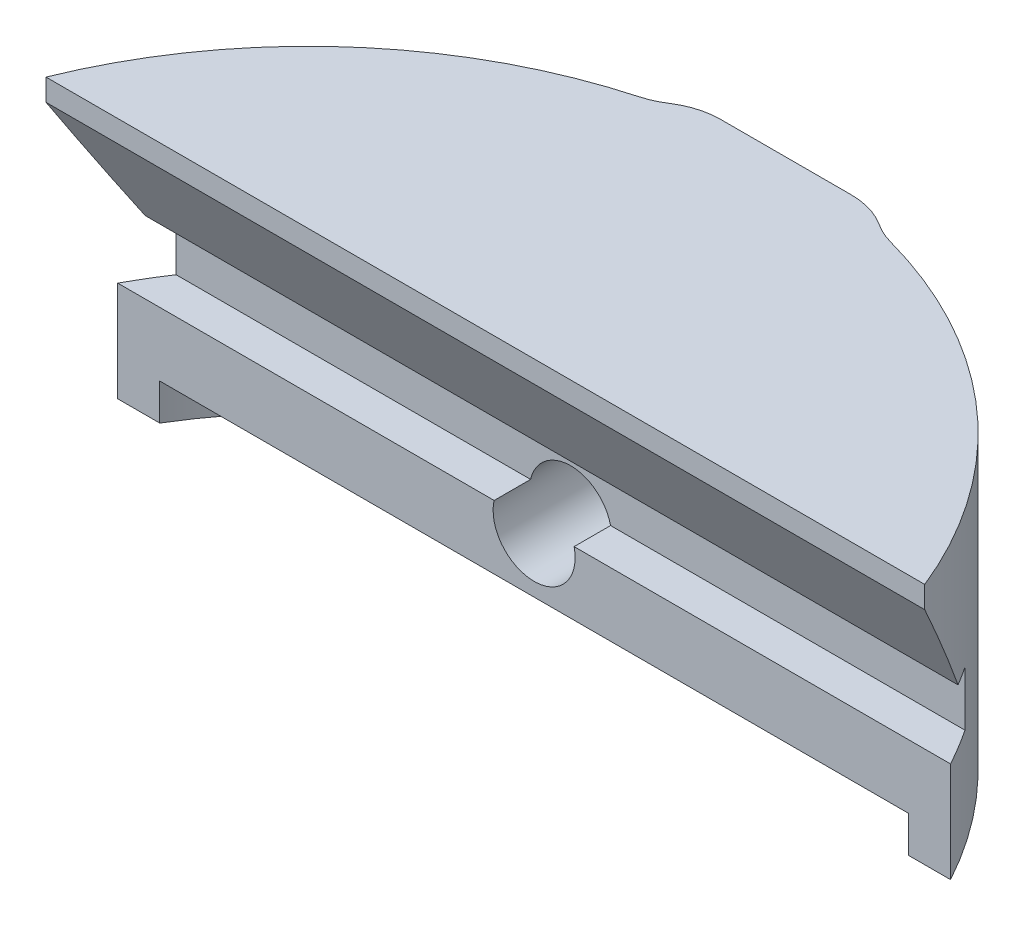
ISO-10303-21;
HEADER;
FILE_DESCRIPTION(('STEP AP214'),'2;1');
FILE_NAME('part.step','',(''),(''),'','','');
FILE_SCHEMA(('AUTOMOTIVE_DESIGN { 1 0 10303 214 1 1 1 1 }'));
ENDSEC;
DATA;
#1=APPLICATION_CONTEXT('core data for automotive mechanical design processes');
#2=APPLICATION_PROTOCOL_DEFINITION('international standard','automotive_design',2000,#1);
#3=PRODUCT_CONTEXT('',#1,'mechanical');
#4=PRODUCT('Part','Part','',(#3));
#5=PRODUCT_RELATED_PRODUCT_CATEGORY('part','',(#4));
#6=PRODUCT_DEFINITION_FORMATION('','',#4);
#7=PRODUCT_DEFINITION_CONTEXT('part definition',#1,'design');
#8=PRODUCT_DEFINITION('design','',#6,#7);
#9=PRODUCT_DEFINITION_SHAPE('','',#8);
#10=(LENGTH_UNIT() NAMED_UNIT(*) SI_UNIT(.MILLI.,.METRE.));
#11=(NAMED_UNIT(*) PLANE_ANGLE_UNIT() SI_UNIT($,.RADIAN.));
#12=(NAMED_UNIT(*) SI_UNIT($,.STERADIAN.) SOLID_ANGLE_UNIT());
#13=UNCERTAINTY_MEASURE_WITH_UNIT(LENGTH_MEASURE(1.E-05),#10,'distance_accuracy_value','');
#14=(GEOMETRIC_REPRESENTATION_CONTEXT(3) GLOBAL_UNCERTAINTY_ASSIGNED_CONTEXT((#13)) GLOBAL_UNIT_ASSIGNED_CONTEXT((#10,
#11,#12)) REPRESENTATION_CONTEXT('',''));
#15=CARTESIAN_POINT('',(0.,0.,0.));
#16=DIRECTION('',(0.,0.,1.));
#17=DIRECTION('',(1.,0.,0.));
#18=AXIS2_PLACEMENT_3D('',#15,#16,#17);
#19=CARTESIAN_POINT('',(-24.1112428610131,3.5,-14.4047005383793));
#20=DIRECTION('',(0.,-1.,0.));
#21=DIRECTION('',(0.,0.,-1.));
#22=AXIS2_PLACEMENT_3D('',#19,#20,#21);
#23=PLANE('',#22);
#24=DIRECTION('',(-1.,0.,0.));
#25=VECTOR('',#24,1.);
#26=CARTESIAN_POINT('',(-26.,3.5,-12.4047005383793));
#27=LINE('',#26,#25);
#28=CARTESIAN_POINT('',(-2.19374109684802,3.5,-12.4047005383793));
#29=VERTEX_POINT('',#28);
#30=CARTESIAN_POINT('',(-22.8500197932766,3.5,-12.4047005383793));
#31=VERTEX_POINT('',#30);
#32=EDGE_CURVE('E234',#29,#31,#27,.T.);
#33=ORIENTED_EDGE('',*,*,#32,.F.);
#34=DIRECTION('',(0.,0.,-1.));
#35=VECTOR('',#34,1.);
#36=CARTESIAN_POINT('',(-2.19374109684802,3.5,-26.2287187078898));
#37=LINE('',#36,#35);
#38=CARTESIAN_POINT('',(-2.19374109684802,3.5,-14.4047005383793));
#39=VERTEX_POINT('',#38);
#40=EDGE_CURVE('E11',#29,#39,#37,.T.);
#41=ORIENTED_EDGE('',*,*,#40,.T.);
#42=DIRECTION('',(1.,0.,0.));
#43=VECTOR('',#42,1.);
#44=CARTESIAN_POINT('',(-24.1112428610131,3.5,-14.4047005383793));
#45=LINE('',#44,#43);
#46=CARTESIAN_POINT('',(-21.6449671378733,3.5,-14.4047005383793));
#47=VERTEX_POINT('',#46);
#48=EDGE_CURVE('E168',#47,#39,#45,.T.);
#49=ORIENTED_EDGE('',*,*,#48,.F.);
#50=CARTESIAN_POINT('',(0.,3.5,0.));
#51=DIRECTION('',(0.,-1.,0.));
#52=DIRECTION('',(0.,0.,-1.));
#53=AXIS2_PLACEMENT_3D('',#50,#51,#52);
#54=CIRCLE('',#53,26.);
#55=EDGE_CURVE('E182',#31,#47,#54,.T.);
#56=ORIENTED_EDGE('',*,*,#55,.F.);
#57=EDGE_LOOP('',(#33,#41,#49,#56));
#58=FACE_BOUND('',#57,.T.);
#59=ADVANCED_FACE('F38',(#58),#23,.F.);
#60=CARTESIAN_POINT('',(0.,14.,0.));
#61=DIRECTION('',(0.,-1.,0.));
#62=DIRECTION('',(0.,0.,-1.));
#63=AXIS2_PLACEMENT_3D('',#60,#61,#62);
#64=CYLINDRICAL_SURFACE('',#63,26.);
#65=CARTESIAN_POINT('',(0.,-2.,0.));
#66=DIRECTION('',(0.,-1.,0.));
#67=DIRECTION('',(0.,0.,-1.));
#68=AXIS2_PLACEMENT_3D('',#65,#66,#67);
#69=CIRCLE('',#68,26.);
#70=CARTESIAN_POINT('',(6.89281123940693,-2.,-25.0696859417486));
#71=VERTEX_POINT('',#70);
#72=CARTESIAN_POINT('',(22.8500197932766,-2.,-12.4047005383793));
#73=VERTEX_POINT('',#72);
#74=EDGE_CURVE('E202',#71,#73,#69,.T.);
#75=ORIENTED_EDGE('',*,*,#74,.F.);
#76=DIRECTION('',(0.,-1.,0.));
#77=VECTOR('',#76,1.);
#78=CARTESIAN_POINT('',(6.89281123940693,14.,-25.0696859417486));
#79=LINE('',#78,#77);
#80=CARTESIAN_POINT('',(6.89281123940693,14.,-25.0696859417486));
#81=VERTEX_POINT('',#80);
#82=EDGE_CURVE('E245',#71,#81,#79,.F.);
#83=ORIENTED_EDGE('',*,*,#82,.T.);
#84=CARTESIAN_POINT('',(0.,14.,0.));
#85=DIRECTION('',(0.,1.,0.));
#86=DIRECTION('',(0.,0.,1.));
#87=AXIS2_PLACEMENT_3D('',#84,#85,#86);
#88=CIRCLE('',#87,26.);
#89=CARTESIAN_POINT('',(24.1112428610131,14.,-9.72871870788977));
#90=VERTEX_POINT('',#89);
#91=EDGE_CURVE('E219',#90,#81,#88,.T.);
#92=ORIENTED_EDGE('',*,*,#91,.F.);
#93=DIRECTION('',(0.,-1.,0.));
#94=VECTOR('',#93,1.);
#95=CARTESIAN_POINT('',(24.1112428610131,14.,-9.72871870788977));
#96=LINE('',#95,#94);
#97=CARTESIAN_POINT('',(24.1112428610131,12.8,-9.72871870788977));
#98=VERTEX_POINT('',#97);
#99=EDGE_CURVE('E215',#90,#98,#96,.T.);
#100=ORIENTED_EDGE('',*,*,#99,.T.);
#101=CARTESIAN_POINT('',(0.,29.6506350946107,0.));
#102=DIRECTION('',(0.,0.500000000000004,-0.866025403784436));
#103=DIRECTION('',(0.,-0.866025403784436,-0.500000000000004));
#104=AXIS2_PLACEMENT_3D('',#101,#102,#103);
#105=ELLIPSE('',#104,51.9999999999995,26.);
#106=CARTESIAN_POINT('',(22.3013310119685,6.5,-13.3660254037844));
#107=VERTEX_POINT('',#106);
#108=EDGE_CURVE('E227',#98,#107,#105,.T.);
#109=ORIENTED_EDGE('',*,*,#108,.T.);
#110=CARTESIAN_POINT('',(0.,6.5,0.));
#111=DIRECTION('',(0.,1.,0.));
#112=DIRECTION('',(0.,0.,1.));
#113=AXIS2_PLACEMENT_3D('',#110,#111,#112);
#114=CIRCLE('',#113,26.);
#115=CARTESIAN_POINT('',(21.6449671378733,6.5,-14.4047005383793));
#116=VERTEX_POINT('',#115);
#117=EDGE_CURVE('E188',#107,#116,#114,.T.);
#118=ORIENTED_EDGE('',*,*,#117,.T.);
#119=DIRECTION('',(0.,-1.,0.));
#120=VECTOR('',#119,1.);
#121=CARTESIAN_POINT('',(21.6449671378733,14.,-14.4047005383793));
#122=LINE('',#121,#120);
#123=CARTESIAN_POINT('',(21.6449671378733,3.5,-14.4047005383793));
#124=VERTEX_POINT('',#123);
#125=EDGE_CURVE('E243',#116,#124,#122,.T.);
#126=ORIENTED_EDGE('',*,*,#125,.T.);
#127=CARTESIAN_POINT('',(22.8500197932766,3.5,-12.4047005383793));
#128=VERTEX_POINT('',#127);
#129=EDGE_CURVE('E173',#124,#128,#54,.T.);
#130=ORIENTED_EDGE('',*,*,#129,.T.);
#131=DIRECTION('',(0.,-1.,0.));
#132=VECTOR('',#131,1.);
#133=CARTESIAN_POINT('',(22.8500197932766,14.,-12.4047005383793));
#134=LINE('',#133,#132);
#135=EDGE_CURVE('E231',#128,#73,#134,.T.);
#136=ORIENTED_EDGE('',*,*,#135,.T.);
#137=EDGE_LOOP('',(#75,#83,#92,#100,#109,#118,#126,#130,#136));
#138=FACE_BOUND('',#137,.T.);
#139=ADVANCED_FACE('F316',(#138),#64,.T.);
#140=CARTESIAN_POINT('',(-6.89281123940694,14.,-25.0696859417486));
#141=VERTEX_POINT('',#140);
#142=CARTESIAN_POINT('',(-24.1112428610131,14.,-9.72871870788977));
#143=VERTEX_POINT('',#142);
#144=EDGE_CURVE('E218',#141,#143,#88,.T.);
#145=ORIENTED_EDGE('',*,*,#144,.F.);
#146=DIRECTION('',(0.,-1.,0.));
#147=VECTOR('',#146,1.);
#148=CARTESIAN_POINT('',(-6.89281123940694,14.,-25.0696859417486));
#149=LINE('',#148,#147);
#150=CARTESIAN_POINT('',(-6.89281123940694,-2.,-25.0696859417486));
#151=VERTEX_POINT('',#150);
#152=EDGE_CURVE('E248',#141,#151,#149,.T.);
#153=ORIENTED_EDGE('',*,*,#152,.T.);
#154=CARTESIAN_POINT('',(-22.8500197932766,-2.,-12.4047005383793));
#155=VERTEX_POINT('',#154);
#156=EDGE_CURVE('E206',#155,#151,#69,.T.);
#157=ORIENTED_EDGE('',*,*,#156,.F.);
#158=DIRECTION('',(0.,-1.,0.));
#159=VECTOR('',#158,1.);
#160=CARTESIAN_POINT('',(-22.8500197932766,14.,-12.4047005383793));
#161=LINE('',#160,#159);
#162=EDGE_CURVE('E228',#155,#31,#161,.F.);
#163=ORIENTED_EDGE('',*,*,#162,.T.);
#164=ORIENTED_EDGE('',*,*,#55,.T.);
#165=DIRECTION('',(0.,-1.,0.));
#166=VECTOR('',#165,1.);
#167=CARTESIAN_POINT('',(-21.6449671378733,14.,-14.4047005383793));
#168=LINE('',#167,#166);
#169=CARTESIAN_POINT('',(-21.6449671378733,6.5,-14.4047005383793));
#170=VERTEX_POINT('',#169);
#171=EDGE_CURVE('E240',#47,#170,#168,.F.);
#172=ORIENTED_EDGE('',*,*,#171,.T.);
#173=CARTESIAN_POINT('',(-22.3013310119685,6.5,-13.3660254037844));
#174=VERTEX_POINT('',#173);
#175=EDGE_CURVE('E185',#170,#174,#114,.T.);
#176=ORIENTED_EDGE('',*,*,#175,.T.);
#177=CARTESIAN_POINT('',(-24.1112428610131,12.8,-9.72871870788977));
#178=VERTEX_POINT('',#177);
#179=EDGE_CURVE('E225',#174,#178,#105,.T.);
#180=ORIENTED_EDGE('',*,*,#179,.T.);
#181=DIRECTION('',(0.,-1.,0.));
#182=VECTOR('',#181,1.);
#183=CARTESIAN_POINT('',(-24.1112428610131,14.,-9.72871870788977));
#184=LINE('',#183,#182);
#185=EDGE_CURVE('E212',#178,#143,#184,.F.);
#186=ORIENTED_EDGE('',*,*,#185,.T.);
#187=EDGE_LOOP('',(#145,#153,#157,#163,#164,#172,#176,#180,#186));
#188=FACE_BOUND('',#187,.T.);
#189=ADVANCED_FACE('F321',(#188),#64,.T.);
#190=CARTESIAN_POINT('',(0.,0.,0.));
#191=DIRECTION('',(0.,1.,0.));
#192=DIRECTION('',(0.,0.,1.));
#193=AXIS2_PLACEMENT_3D('',#190,#191,#192);
#194=PLANE('',#193);
#195=CARTESIAN_POINT('',(0.,0.,0.));
#196=DIRECTION('',(0.,-1.,0.));
#197=DIRECTION('',(0.,0.,-1.));
#198=AXIS2_PLACEMENT_3D('',#195,#196,#197);
#199=CIRCLE('',#198,24.);
#200=CARTESIAN_POINT('',(-20.5456419844485,0.,-12.4047005383793));
#201=VERTEX_POINT('',#200);
#202=CARTESIAN_POINT('',(20.5456419844485,0.,-12.4047005383793));
#203=VERTEX_POINT('',#202);
#204=EDGE_CURVE('E203',#201,#203,#199,.T.);
#205=ORIENTED_EDGE('',*,*,#204,.T.);
#206=DIRECTION('',(-1.,0.,0.));
#207=VECTOR('',#206,1.);
#208=CARTESIAN_POINT('',(0.,0.,-12.4047005383793));
#209=LINE('',#208,#207);
#210=EDGE_CURVE('E194',#203,#201,#209,.T.);
#211=ORIENTED_EDGE('',*,*,#210,.T.);
#212=EDGE_LOOP('',(#205,#211));
#213=FACE_BOUND('',#212,.T.);
#214=ADVANCED_FACE('F338',(#213),#194,.F.);
#215=CARTESIAN_POINT('',(0.,-2.,0.));
#216=DIRECTION('',(0.,-1.,0.));
#217=DIRECTION('',(0.,0.,-1.));
#218=AXIS2_PLACEMENT_3D('',#215,#216,#217);
#219=PLANE('',#218);
#220=DIRECTION('',(-1.,0.,0.));
#221=VECTOR('',#220,1.);
#222=CARTESIAN_POINT('',(-5.,-2.,-26.2287187078898));
#223=LINE('',#222,#221);
#224=CARTESIAN_POINT('',(3.57843944253177,-2.,-26.2287187078898));
#225=VERTEX_POINT('',#224);
#226=CARTESIAN_POINT('',(-3.57843944253178,-2.,-26.2287187078898));
#227=VERTEX_POINT('',#226);
#228=EDGE_CURVE('E175',#225,#227,#223,.T.);
#229=ORIENTED_EDGE('',*,*,#228,.F.);
#230=CARTESIAN_POINT('',(3.57843944253177,-2.,-22.2287187078898));
#231=DIRECTION('',(0.,-1.,0.));
#232=DIRECTION('',(0.,0.,-1.));
#233=AXIS2_PLACEMENT_3D('',#230,#231,#232);
#234=CIRCLE('',#233,4.);
#235=CARTESIAN_POINT('',(5.76584159015449,-2.,-25.5776397049537));
#236=VERTEX_POINT('',#235);
#237=EDGE_CURVE('E273',#225,#236,#234,.T.);
#238=ORIENTED_EDGE('',*,*,#237,.T.);
#239=CARTESIAN_POINT('',(7.95324373777722,-2.,-28.9265607020176));
#240=DIRECTION('',(0.,-1.,0.));
#241=DIRECTION('',(0.,0.,-1.));
#242=AXIS2_PLACEMENT_3D('',#239,#240,#241);
#243=CIRCLE('',#242,4.);
#244=EDGE_CURVE('E253',#236,#71,#243,.F.);
#245=ORIENTED_EDGE('',*,*,#244,.T.);
#246=ORIENTED_EDGE('',*,*,#74,.T.);
#247=DIRECTION('',(1.,0.,0.));
#248=VECTOR('',#247,1.);
#249=CARTESIAN_POINT('',(0.,-2.,-12.4047005383793));
#250=LINE('',#249,#248);
#251=CARTESIAN_POINT('',(20.5456419844485,-2.,-12.4047005383793));
#252=VERTEX_POINT('',#251);
#253=EDGE_CURVE('E192',#252,#73,#250,.T.);
#254=ORIENTED_EDGE('',*,*,#253,.F.);
#255=CARTESIAN_POINT('',(0.,-2.,0.));
#256=DIRECTION('',(0.,-1.,0.));
#257=DIRECTION('',(0.,0.,-1.));
#258=AXIS2_PLACEMENT_3D('',#255,#256,#257);
#259=CIRCLE('',#258,24.);
#260=CARTESIAN_POINT('',(-20.5456419844485,-2.,-12.4047005383793));
#261=VERTEX_POINT('',#260);
#262=EDGE_CURVE('E199',#261,#252,#259,.T.);
#263=ORIENTED_EDGE('',*,*,#262,.F.);
#264=EDGE_CURVE('E189',#155,#261,#250,.T.);
#265=ORIENTED_EDGE('',*,*,#264,.F.);
#266=ORIENTED_EDGE('',*,*,#156,.T.);
#267=CARTESIAN_POINT('',(-7.95324373777724,-2.,-28.9265607020176));
#268=DIRECTION('',(0.,-1.,0.));
#269=DIRECTION('',(0.,0.,-1.));
#270=AXIS2_PLACEMENT_3D('',#267,#268,#269);
#271=CIRCLE('',#270,4.);
#272=CARTESIAN_POINT('',(-5.76584159015451,-2.,-25.5776397049537));
#273=VERTEX_POINT('',#272);
#274=EDGE_CURVE('E257',#151,#273,#271,.F.);
#275=ORIENTED_EDGE('',*,*,#274,.T.);
#276=CARTESIAN_POINT('',(-3.57843944253178,-2.,-22.2287187078898));
#277=DIRECTION('',(0.,-1.,0.));
#278=DIRECTION('',(0.,0.,-1.));
#279=AXIS2_PLACEMENT_3D('',#276,#277,#278);
#280=CIRCLE('',#279,4.);
#281=EDGE_CURVE('E271',#273,#227,#280,.T.);
#282=ORIENTED_EDGE('',*,*,#281,.T.);
#283=EDGE_LOOP('',(#229,#238,#245,#246,#254,#263,#265,#266,#275,#282));
#284=FACE_BOUND('',#283,.T.);
#285=ADVANCED_FACE('F279',(#284),#219,.T.);
#286=CARTESIAN_POINT('',(0.,-2.,0.));
#287=DIRECTION('',(0.,1.,0.));
#288=DIRECTION('',(0.,0.,1.));
#289=AXIS2_PLACEMENT_3D('',#286,#287,#288);
#290=CYLINDRICAL_SURFACE('',#289,24.);
#291=DIRECTION('',(0.,1.,0.));
#292=VECTOR('',#291,1.);
#293=CARTESIAN_POINT('',(-20.5456419844485,-2.,-12.4047005383793));
#294=LINE('',#293,#292);
#295=EDGE_CURVE('E191',#261,#201,#294,.T.);
#296=ORIENTED_EDGE('',*,*,#295,.F.);
#297=ORIENTED_EDGE('',*,*,#262,.T.);
#298=DIRECTION('',(0.,1.,0.));
#299=VECTOR('',#298,1.);
#300=CARTESIAN_POINT('',(20.5456419844485,-2.,-12.4047005383793));
#301=LINE('',#300,#299);
#302=EDGE_CURVE('E197',#203,#252,#301,.F.);
#303=ORIENTED_EDGE('',*,*,#302,.F.);
#304=ORIENTED_EDGE('',*,*,#204,.F.);
#305=EDGE_LOOP('',(#296,#297,#303,#304));
#306=FACE_BOUND('',#305,.T.);
#307=ADVANCED_FACE('F332',(#306),#290,.F.);
#308=CARTESIAN_POINT('',(0.,14.,0.));
#309=DIRECTION('',(0.,1.,0.));
#310=DIRECTION('',(0.,0.,1.));
#311=AXIS2_PLACEMENT_3D('',#308,#309,#310);
#312=PLANE('',#311);
#313=CARTESIAN_POINT('',(7.95324373777722,14.,-28.9265607020176));
#314=DIRECTION('',(0.,1.,0.));
#315=DIRECTION('',(0.,0.,1.));
#316=AXIS2_PLACEMENT_3D('',#313,#314,#315);
#317=CIRCLE('',#316,4.);
#318=CARTESIAN_POINT('',(5.76584159015449,14.,-25.5776397049537));
#319=VERTEX_POINT('',#318);
#320=EDGE_CURVE('E250',#81,#319,#317,.F.);
#321=ORIENTED_EDGE('',*,*,#320,.T.);
#322=CARTESIAN_POINT('',(3.57843944253177,14.,-22.2287187078898));
#323=DIRECTION('',(0.,1.,0.));
#324=DIRECTION('',(0.,0.,1.));
#325=AXIS2_PLACEMENT_3D('',#322,#323,#324);
#326=CIRCLE('',#325,4.);
#327=CARTESIAN_POINT('',(3.57843944253177,14.,-26.2287187078898));
#328=VERTEX_POINT('',#327);
#329=EDGE_CURVE('E264',#319,#328,#326,.T.);
#330=ORIENTED_EDGE('',*,*,#329,.T.);
#331=DIRECTION('',(-1.,0.,0.));
#332=VECTOR('',#331,1.);
#333=CARTESIAN_POINT('',(-5.,14.,-26.2287187078898));
#334=LINE('',#333,#332);
#335=CARTESIAN_POINT('',(-3.57843944253178,14.,-26.2287187078898));
#336=VERTEX_POINT('',#335);
#337=EDGE_CURVE('E169',#328,#336,#334,.T.);
#338=ORIENTED_EDGE('',*,*,#337,.T.);
#339=CARTESIAN_POINT('',(-3.57843944253178,14.,-22.2287187078898));
#340=DIRECTION('',(0.,1.,0.));
#341=DIRECTION('',(0.,0.,1.));
#342=AXIS2_PLACEMENT_3D('',#339,#340,#341);
#343=CIRCLE('',#342,4.);
#344=CARTESIAN_POINT('',(-5.76584159015451,14.,-25.5776397049537));
#345=VERTEX_POINT('',#344);
#346=EDGE_CURVE('E262',#336,#345,#343,.T.);
#347=ORIENTED_EDGE('',*,*,#346,.T.);
#348=CARTESIAN_POINT('',(-7.95324373777724,14.,-28.9265607020176));
#349=DIRECTION('',(0.,1.,0.));
#350=DIRECTION('',(0.,0.,1.));
#351=AXIS2_PLACEMENT_3D('',#348,#349,#350);
#352=CIRCLE('',#351,4.);
#353=EDGE_CURVE('E255',#345,#141,#352,.F.);
#354=ORIENTED_EDGE('',*,*,#353,.T.);
#355=ORIENTED_EDGE('',*,*,#144,.T.);
#356=DIRECTION('',(-1.,0.,0.));
#357=VECTOR('',#356,1.);
#358=CARTESIAN_POINT('',(0.,14.,-9.72871870788977));
#359=LINE('',#358,#357);
#360=EDGE_CURVE('E222',#90,#143,#359,.T.);
#361=ORIENTED_EDGE('',*,*,#360,.F.);
#362=ORIENTED_EDGE('',*,*,#91,.T.);
#363=EDGE_LOOP('',(#321,#330,#338,#347,#354,#355,#361,#362));
#364=FACE_BOUND('',#363,.T.);
#365=ADVANCED_FACE('F291',(#364),#312,.T.);
#366=CARTESIAN_POINT('',(-30.,6.00000000000001,-13.6547005383793));
#367=DIRECTION('',(0.,0.500000000000004,-0.866025403784436));
#368=DIRECTION('',(0.,0.866025403784436,0.500000000000004));
#369=AXIS2_PLACEMENT_3D('',#366,#367,#368);
#370=PLANE('',#369);
#371=ORIENTED_EDGE('',*,*,#179,.F.);
#372=DIRECTION('',(1.,0.,0.));
#373=VECTOR('',#372,1.);
#374=CARTESIAN_POINT('',(-30.,6.5,-13.3660254037844));
#375=LINE('',#374,#373);
#376=EDGE_CURVE('E237',#174,#107,#375,.T.);
#377=ORIENTED_EDGE('',*,*,#376,.T.);
#378=ORIENTED_EDGE('',*,*,#108,.F.);
#379=DIRECTION('',(1.,0.,0.));
#380=VECTOR('',#379,1.);
#381=CARTESIAN_POINT('',(-30.,12.8,-9.72871870788977));
#382=LINE('',#381,#380);
#383=EDGE_CURVE('E209',#178,#98,#382,.T.);
#384=ORIENTED_EDGE('',*,*,#383,.F.);
#385=EDGE_LOOP('',(#371,#377,#378,#384));
#386=FACE_BOUND('',#385,.T.);
#387=ADVANCED_FACE('F341',(#386),#370,.F.);
#388=CARTESIAN_POINT('',(-30.,12.8,-9.72871870788977));
#389=DIRECTION('',(0.,0.,-1.));
#390=DIRECTION('',(-1.,0.,0.));
#391=AXIS2_PLACEMENT_3D('',#388,#389,#390);
#392=PLANE('',#391);
#393=ORIENTED_EDGE('',*,*,#360,.T.);
#394=ORIENTED_EDGE('',*,*,#185,.F.);
#395=ORIENTED_EDGE('',*,*,#383,.T.);
#396=ORIENTED_EDGE('',*,*,#99,.F.);
#397=EDGE_LOOP('',(#393,#394,#395,#396));
#398=FACE_BOUND('',#397,.T.);
#399=ADVANCED_FACE('F330',(#398),#392,.F.);
#400=CARTESIAN_POINT('',(-26.,6.00000000000001,-12.4047005383793));
#401=DIRECTION('',(0.,0.,-1.));
#402=DIRECTION('',(0.,1.,0.));
#403=AXIS2_PLACEMENT_3D('',#400,#401,#402);
#404=PLANE('',#403);
#405=CARTESIAN_POINT('',(2.19374109684802,3.5,-12.4047005383793));
#406=VERTEX_POINT('',#405);
#407=EDGE_CURVE('E235',#128,#406,#27,.T.);
#408=ORIENTED_EDGE('',*,*,#407,.T.);
#409=CARTESIAN_POINT('',(0.,3.,-12.4047005383793));
#410=DIRECTION('',(0.,0.,-1.));
#411=DIRECTION('',(0.,1.,0.));
#412=AXIS2_PLACEMENT_3D('',#409,#410,#411);
#413=CIRCLE('',#412,2.24999999999999);
#414=EDGE_CURVE('E53',#406,#29,#413,.T.);
#415=ORIENTED_EDGE('',*,*,#414,.T.);
#416=ORIENTED_EDGE('',*,*,#32,.T.);
#417=ORIENTED_EDGE('',*,*,#162,.F.);
#418=ORIENTED_EDGE('',*,*,#264,.T.);
#419=ORIENTED_EDGE('',*,*,#295,.T.);
#420=ORIENTED_EDGE('',*,*,#210,.F.);
#421=ORIENTED_EDGE('',*,*,#302,.T.);
#422=ORIENTED_EDGE('',*,*,#253,.T.);
#423=ORIENTED_EDGE('',*,*,#135,.F.);
#424=EDGE_LOOP('',(#408,#415,#416,#417,#418,#419,#420,#421,#422,#423));
#425=FACE_BOUND('',#424,.T.);
#426=ADVANCED_FACE('F327',(#425),#404,.F.);
#427=CARTESIAN_POINT('',(-24.1112428610131,6.5,-14.4047005383793));
#428=DIRECTION('',(0.,0.,-1.));
#429=DIRECTION('',(-1.,0.,0.));
#430=AXIS2_PLACEMENT_3D('',#427,#428,#429);
#431=PLANE('',#430);
#432=ORIENTED_EDGE('',*,*,#48,.T.);
#433=CARTESIAN_POINT('',(0.,3.,-14.4047005383793));
#434=DIRECTION('',(0.,0.,-1.));
#435=DIRECTION('',(-1.,0.,0.));
#436=AXIS2_PLACEMENT_3D('',#433,#434,#435);
#437=CIRCLE('',#436,2.24999999999999);
#438=CARTESIAN_POINT('',(2.19374109684802,3.5,-14.4047005383793));
#439=VERTEX_POINT('',#438);
#440=EDGE_CURVE('E158',#39,#439,#437,.T.);
#441=ORIENTED_EDGE('',*,*,#440,.T.);
#442=EDGE_CURVE('E165',#439,#124,#45,.T.);
#443=ORIENTED_EDGE('',*,*,#442,.T.);
#444=ORIENTED_EDGE('',*,*,#125,.F.);
#445=DIRECTION('',(1.,0.,0.));
#446=VECTOR('',#445,1.);
#447=CARTESIAN_POINT('',(-24.1112428610131,6.5,-14.4047005383793));
#448=LINE('',#447,#446);
#449=EDGE_CURVE('E177',#170,#116,#448,.T.);
#450=ORIENTED_EDGE('',*,*,#449,.F.);
#451=ORIENTED_EDGE('',*,*,#171,.F.);
#452=EDGE_LOOP('',(#432,#441,#443,#444,#450,#451));
#453=FACE_BOUND('',#452,.T.);
#454=ADVANCED_FACE('F164',(#453),#431,.F.);
#455=CARTESIAN_POINT('',(-24.1112428610131,6.5,-12.4047005383793));
#456=DIRECTION('',(0.,1.,0.));
#457=DIRECTION('',(0.,0.,1.));
#458=AXIS2_PLACEMENT_3D('',#455,#456,#457);
#459=PLANE('',#458);
#460=ORIENTED_EDGE('',*,*,#376,.F.);
#461=ORIENTED_EDGE('',*,*,#175,.F.);
#462=ORIENTED_EDGE('',*,*,#449,.T.);
#463=ORIENTED_EDGE('',*,*,#117,.F.);
#464=EDGE_LOOP('',(#460,#461,#462,#463));
#465=FACE_BOUND('',#464,.T.);
#466=ADVANCED_FACE('F311',(#465),#459,.F.);
#467=ORIENTED_EDGE('',*,*,#442,.F.);
#468=DIRECTION('',(0.,0.,-1.));
#469=VECTOR('',#468,1.);
#470=CARTESIAN_POINT('',(2.19374109684802,3.5,-26.2287187078898));
#471=LINE('',#470,#469);
#472=EDGE_CURVE('E46',#439,#406,#471,.F.);
#473=ORIENTED_EDGE('',*,*,#472,.T.);
#474=ORIENTED_EDGE('',*,*,#407,.F.);
#475=ORIENTED_EDGE('',*,*,#129,.F.);
#476=EDGE_LOOP('',(#467,#473,#474,#475));
#477=FACE_BOUND('',#476,.T.);
#478=ADVANCED_FACE('F171',(#477),#23,.F.);
#479=CARTESIAN_POINT('',(-5.,-12.0254586113071,-26.2287187078898));
#480=DIRECTION('',(0.,0.,-1.));
#481=DIRECTION('',(-1.,0.,0.));
#482=AXIS2_PLACEMENT_3D('',#479,#480,#481);
#483=PLANE('',#482);
#484=CARTESIAN_POINT('',(0.,3.,-26.2287187078898));
#485=DIRECTION('',(0.,0.,-1.));
#486=DIRECTION('',(-1.,0.,0.));
#487=AXIS2_PLACEMENT_3D('',#484,#485,#486);
#488=CIRCLE('',#487,2.24999999999999);
#489=CARTESIAN_POINT('',(-2.24999999999999,3.,-26.2287187078898));
#490=VERTEX_POINT('',#489);
#491=EDGE_CURVE('E298',#490,#490,#488,.T.);
#492=ORIENTED_EDGE('',*,*,#491,.F.);
#493=EDGE_LOOP('',(#492));
#494=FACE_BOUND('',#493,.T.);
#495=ORIENTED_EDGE('',*,*,#337,.F.);
#496=DIRECTION('',(0.,1.,0.));
#497=VECTOR('',#496,1.);
#498=CARTESIAN_POINT('',(3.57843944253177,-2.,-26.2287187078898));
#499=LINE('',#498,#497);
#500=EDGE_CURVE('E269',#328,#225,#499,.F.);
#501=ORIENTED_EDGE('',*,*,#500,.T.);
#502=ORIENTED_EDGE('',*,*,#228,.T.);
#503=DIRECTION('',(0.,1.,0.));
#504=VECTOR('',#503,1.);
#505=CARTESIAN_POINT('',(-3.57843944253178,14.,-26.2287187078898));
#506=LINE('',#505,#504);
#507=EDGE_CURVE('E266',#227,#336,#506,.T.);
#508=ORIENTED_EDGE('',*,*,#507,.T.);
#509=EDGE_LOOP('',(#495,#501,#502,#508));
#510=FACE_BOUND('',#509,.T.);
#511=ADVANCED_FACE('F293',(#494,#510),#483,.T.);
#512=CARTESIAN_POINT('',(7.95324373777722,-12.0254586113071,-28.9265607020176));
#513=DIRECTION('',(0.,-1.,0.));
#514=DIRECTION('',(0.,0.,-1.));
#515=AXIS2_PLACEMENT_3D('',#512,#513,#514);
#516=CYLINDRICAL_SURFACE('',#515,4.);
#517=ORIENTED_EDGE('',*,*,#244,.F.);
#518=DIRECTION('',(0.,-1.,0.));
#519=VECTOR('',#518,1.);
#520=CARTESIAN_POINT('',(5.76584159015449,-12.0254586113071,-25.5776397049537));
#521=LINE('',#520,#519);
#522=EDGE_CURVE('E259',#236,#319,#521,.F.);
#523=ORIENTED_EDGE('',*,*,#522,.T.);
#524=ORIENTED_EDGE('',*,*,#320,.F.);
#525=ORIENTED_EDGE('',*,*,#82,.F.);
#526=EDGE_LOOP('',(#517,#523,#524,#525));
#527=FACE_BOUND('',#526,.T.);
#528=ADVANCED_FACE('F286',(#527),#516,.F.);
#529=CARTESIAN_POINT('',(-7.95324373777724,14.,-28.9265607020176));
#530=DIRECTION('',(0.,-1.,0.));
#531=DIRECTION('',(0.,0.,-1.));
#532=AXIS2_PLACEMENT_3D('',#529,#530,#531);
#533=CYLINDRICAL_SURFACE('',#532,4.);
#534=ORIENTED_EDGE('',*,*,#353,.F.);
#535=DIRECTION('',(0.,-1.,0.));
#536=VECTOR('',#535,1.);
#537=CARTESIAN_POINT('',(-5.76584159015451,14.,-25.5776397049537));
#538=LINE('',#537,#536);
#539=EDGE_CURVE('E61',#345,#273,#538,.T.);
#540=ORIENTED_EDGE('',*,*,#539,.T.);
#541=ORIENTED_EDGE('',*,*,#274,.F.);
#542=ORIENTED_EDGE('',*,*,#152,.F.);
#543=EDGE_LOOP('',(#534,#540,#541,#542));
#544=FACE_BOUND('',#543,.T.);
#545=ADVANCED_FACE('F309',(#544),#533,.F.);
#546=CARTESIAN_POINT('',(3.57843944253177,-12.0254586113071,-22.2287187078898));
#547=DIRECTION('',(0.,-1.,0.));
#548=DIRECTION('',(0.,0.,-1.));
#549=AXIS2_PLACEMENT_3D('',#546,#547,#548);
#550=CYLINDRICAL_SURFACE('',#549,4.);
#551=ORIENTED_EDGE('',*,*,#237,.F.);
#552=ORIENTED_EDGE('',*,*,#500,.F.);
#553=ORIENTED_EDGE('',*,*,#329,.F.);
#554=ORIENTED_EDGE('',*,*,#522,.F.);
#555=EDGE_LOOP('',(#551,#552,#553,#554));
#556=FACE_BOUND('',#555,.T.);
#557=ADVANCED_FACE('F287',(#556),#550,.T.);
#558=CARTESIAN_POINT('',(-3.57843944253178,14.,-22.2287187078898));
#559=DIRECTION('',(0.,-1.,0.));
#560=DIRECTION('',(0.,0.,-1.));
#561=AXIS2_PLACEMENT_3D('',#558,#559,#560);
#562=CYLINDRICAL_SURFACE('',#561,4.);
#563=ORIENTED_EDGE('',*,*,#281,.F.);
#564=ORIENTED_EDGE('',*,*,#539,.F.);
#565=ORIENTED_EDGE('',*,*,#346,.F.);
#566=ORIENTED_EDGE('',*,*,#507,.F.);
#567=EDGE_LOOP('',(#563,#564,#565,#566));
#568=FACE_BOUND('',#567,.T.);
#569=ADVANCED_FACE('F40',(#568),#562,.T.);
#570=CARTESIAN_POINT('',(0.,3.,-26.2287187078898));
#571=DIRECTION('',(0.,0.,-1.));
#572=DIRECTION('',(-1.,0.,0.));
#573=AXIS2_PLACEMENT_3D('',#570,#571,#572);
#574=CYLINDRICAL_SURFACE('',#573,2.24999999999999);
#575=ORIENTED_EDGE('',*,*,#491,.T.);
#576=EDGE_LOOP('',(#575));
#577=FACE_BOUND('',#576,.T.);
#578=ORIENTED_EDGE('',*,*,#414,.F.);
#579=ORIENTED_EDGE('',*,*,#472,.F.);
#580=ORIENTED_EDGE('',*,*,#440,.F.);
#581=ORIENTED_EDGE('',*,*,#40,.F.);
#582=EDGE_LOOP('',(#578,#579,#580,#581));
#583=FACE_BOUND('',#582,.T.);
#584=ADVANCED_FACE('F157',(#577,#583),#574,.F.);
#585=CLOSED_SHELL('',(#59,#139,#189,#214,#285,#307,#365,#387,#399,#426,#454,#466,#478,#511,#528,
#545,#557,#569,#584));
#586=MANIFOLD_SOLID_BREP('B2',#585);
#587=ADVANCED_BREP_SHAPE_REPRESENTATION('',(#18,#586),#14);
#588=SHAPE_DEFINITION_REPRESENTATION(#9,#587);
ENDSEC;
END-ISO-10303-21;
